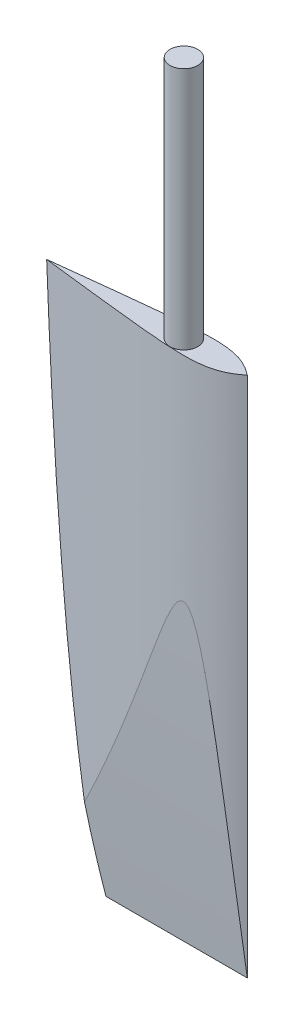
ISO-10303-21;
HEADER;
FILE_DESCRIPTION(('STEP AP214'),'2;1');
FILE_NAME('part.step','',(''),(''),'','','');
FILE_SCHEMA(('AUTOMOTIVE_DESIGN { 1 0 10303 214 1 1 1 1 }'));
ENDSEC;
DATA;
#1=APPLICATION_CONTEXT('core data for automotive mechanical design processes');
#2=APPLICATION_PROTOCOL_DEFINITION('international standard','automotive_design',2000,#1);
#3=PRODUCT_CONTEXT('',#1,'mechanical');
#4=PRODUCT('Part','Part','',(#3));
#5=PRODUCT_RELATED_PRODUCT_CATEGORY('part','',(#4));
#6=PRODUCT_DEFINITION_FORMATION('','',#4);
#7=PRODUCT_DEFINITION_CONTEXT('part definition',#1,'design');
#8=PRODUCT_DEFINITION('design','',#6,#7);
#9=PRODUCT_DEFINITION_SHAPE('','',#8);
#10=(LENGTH_UNIT() NAMED_UNIT(*) SI_UNIT(.MILLI.,.METRE.));
#11=(NAMED_UNIT(*) PLANE_ANGLE_UNIT() SI_UNIT($,.RADIAN.));
#12=(NAMED_UNIT(*) SI_UNIT($,.STERADIAN.) SOLID_ANGLE_UNIT());
#13=UNCERTAINTY_MEASURE_WITH_UNIT(LENGTH_MEASURE(1.E-05),#10,'distance_accuracy_value','');
#14=(GEOMETRIC_REPRESENTATION_CONTEXT(3) GLOBAL_UNCERTAINTY_ASSIGNED_CONTEXT((#13)) GLOBAL_UNIT_ASSIGNED_CONTEXT((#10,
#11,#12)) REPRESENTATION_CONTEXT('',''));
#15=CARTESIAN_POINT('',(0.,0.,0.));
#16=DIRECTION('',(0.,0.,1.));
#17=DIRECTION('',(1.,0.,0.));
#18=AXIS2_PLACEMENT_3D('',#15,#16,#17);
#19=CARTESIAN_POINT('',(9.11438835745229,-75.,0.));
#20=CARTESIAN_POINT('',(5.1335415190364,-75.,3.10462526864879));
#21=CARTESIAN_POINT('',(2.0653861128247,-75.,2.48117780207058));
#22=CARTESIAN_POINT('',(-19.7170451046892,-75.,0.));
#23=B_SPLINE_CURVE_WITH_KNOTS('',3,(#19,#20,#21,#22),.UNSPECIFIED.,.F.,.F.,(4,4),(0.,1.),.UNSPECIFIED.);
#24=DIRECTION('',(0.,1.,0.));
#25=VECTOR('',#24,1.);
#26=SURFACE_OF_LINEAR_EXTRUSION('',#23,#25);
#27=CARTESIAN_POINT('',(9.11438835745229,-75.,0.));
#28=CARTESIAN_POINT('',(9.02791330218049,-74.0256277634483,0.0674326613923812));
#29=CARTESIAN_POINT('',(8.94120435272638,-73.0511908608038,0.13364105846246));
#30=CARTESIAN_POINT('',(8.76669162256768,-71.1010093409619,0.26362649330421));
#31=CARTESIAN_POINT('',(8.67888659948901,-70.1252646237755,0.327400360832244));
#32=CARTESIAN_POINT('',(8.50168240376331,-68.1727797983576,0.45242542912736));
#33=CARTESIAN_POINT('',(8.41228173870845,-67.1960396611863,0.513674069469376));
#34=CARTESIAN_POINT('',(8.23129873934822,-65.2418849312636,0.633556690601031));
#35=CARTESIAN_POINT('',(8.13971487292022,-64.2644703619941,0.692188746988952));
#36=CARTESIAN_POINT('',(7.95369224847968,-62.3092954016953,0.806746393799288));
#37=CARTESIAN_POINT('',(7.85925218866321,-61.3315350600015,0.862670718935928));
#38=CARTESIAN_POINT('',(7.66672681363479,-59.3760082423912,0.971721091397303));
#39=CARTESIAN_POINT('',(7.56864073692468,-58.3982418083236,1.02484654849274));
#40=CARTESIAN_POINT('',(7.36171535963916,-56.3829901725165,1.13138290548702));
#41=CARTESIAN_POINT('',(7.25258560456741,-55.3455249794059,1.18461098864575));
#42=CARTESIAN_POINT('',(7.02775556366977,-53.2713421104585,1.28770617560209));
#43=CARTESIAN_POINT('',(6.91205656153735,-52.2346243283941,1.33757393190312));
#44=CARTESIAN_POINT('',(6.672287633419,-50.1623699469067,1.43384054300639));
#45=CARTESIAN_POINT('',(6.5482207705174,-49.1268330548569,1.48024065418127));
#46=CARTESIAN_POINT('',(6.35393698226747,-47.5746911524056,1.54716195278202));
#47=CARTESIAN_POINT('',(6.28782868300554,-47.0576286156837,1.56901764070525));
#48=CARTESIAN_POINT('',(6.152445226113,-46.0238816363463,1.61182621695569));
#49=CARTESIAN_POINT('',(6.08317008092178,-45.5071971922536,1.63277910882846));
#50=CARTESIAN_POINT('',(5.94096995765408,-44.4745566796208,1.67375708302899));
#51=CARTESIAN_POINT('',(5.86804682405096,-43.9586003759368,1.69378262456902));
#52=CARTESIAN_POINT('',(5.71785045448301,-42.9272879565016,1.73290128775518));
#53=CARTESIAN_POINT('',(5.64057725606253,-42.4119318356095,1.75199441744608));
#54=CARTESIAN_POINT('',(5.4808082720536,-41.3821237766656,1.7892269816325));
#55=CARTESIAN_POINT('',(5.39831378614404,-40.8676716461067,1.8073666514207));
#56=CARTESIAN_POINT('',(5.2268611918578,-39.8398168439078,1.84267847723422));
#57=CARTESIAN_POINT('',(5.13790326475997,-39.3264141432495,1.85985066037047));
#58=CARTESIAN_POINT('',(4.99865891695445,-38.5597721197334,1.88479044997102));
#59=CARTESIAN_POINT('',(4.95150883418106,-38.3059745668074,1.89293129621597));
#60=CARTESIAN_POINT('',(4.85483851194004,-37.7987801155866,1.9089683375384));
#61=CARTESIAN_POINT('',(4.80531789628173,-37.5453832875201,1.91686449345512));
#62=CARTESIAN_POINT('',(4.70349976880782,-37.0390457049813,1.93240985075691));
#63=CARTESIAN_POINT('',(4.65120128282113,-36.786105143101,1.94005896397413));
#64=CARTESIAN_POINT('',(4.5432831781724,-36.2807620521463,1.95510739128665));
#65=CARTESIAN_POINT('',(4.48766155431423,-36.0283599450702,1.96250655025646));
#66=CARTESIAN_POINT('',(4.37277022521815,-35.5260393166599,1.9769987988232));
#67=CARTESIAN_POINT('',(4.31352557686247,-35.2761151453946,1.98409351643389));
#68=CARTESIAN_POINT('',(4.19008295522094,-34.7775155712979,1.99801674955925));
#69=CARTESIAN_POINT('',(4.12588564615142,-34.5288400057602,2.00484530058606));
#70=CARTESIAN_POINT('',(3.99111216058201,-34.0333987766084,2.01822038168161));
#71=CARTESIAN_POINT('',(3.92054105679476,-33.7866317609291,2.02476713000653));
#72=CARTESIAN_POINT('',(3.80808279704943,-33.4185812309951,2.03436167834496));
#73=CARTESIAN_POINT('',(3.7695104676599,-33.2962883324942,2.03752124481927));
#74=CARTESIAN_POINT('',(3.68969355580781,-33.0525787032477,2.04376161586078));
#75=CARTESIAN_POINT('',(3.64844912448883,-32.9311619233766,2.04684242486905));
#76=CARTESIAN_POINT('',(3.56259643930917,-32.6892481578053,2.05292527863883));
#77=CARTESIAN_POINT('',(3.51798183764883,-32.5687534035837,2.05592715964783));
#78=CARTESIAN_POINT('',(3.42455490409411,-32.3293087764526,2.06183798635663));
#79=CARTESIAN_POINT('',(3.37574010794178,-32.2103598582404,2.06474687610686));
#80=CARTESIAN_POINT('',(3.27236344825315,-31.9741642178653,2.07047004040162));
#81=CARTESIAN_POINT('',(3.21777190927501,-31.8569301931658,2.07328371763761));
#82=CARTESIAN_POINT('',(3.13018539373064,-31.6840252864044,2.07739565276573));
#83=CARTESIAN_POINT('',(3.10005492784772,-31.6269064964481,2.07874761433164));
#84=CARTESIAN_POINT('',(3.03749034337446,-31.5139494986544,2.08140904644917));
#85=CARTESIAN_POINT('',(3.005056710571,-31.4581110240389,2.08271852587679));
#86=CARTESIAN_POINT('',(2.93679056837549,-31.3471969966507,2.08530795911265));
#87=CARTESIAN_POINT('',(2.90090892794699,-31.2921513987774,2.08658700897921));
#88=CARTESIAN_POINT('',(2.82553725415653,-31.1846093660097,2.08907488131302));
#89=CARTESIAN_POINT('',(2.78604987648969,-31.1321110979098,2.09028375441035));
#90=CARTESIAN_POINT('',(2.70289443652817,-31.0313291839522,2.0925948321861));
#91=CARTESIAN_POINT('',(2.65927043082211,-30.9830097325643,2.09369795424529));
#92=CARTESIAN_POINT('',(2.56644242607435,-30.8921543941663,2.09576447751712));
#93=CARTESIAN_POINT('',(2.51725713407338,-30.8496001171732,2.09672832368569));
#94=CARTESIAN_POINT('',(2.42794459123065,-30.7850558655047,2.09818590346269));
#95=CARTESIAN_POINT('',(2.38953296272161,-30.7607280325339,2.09873389098076));
#96=CARTESIAN_POINT('',(2.30937364785024,-30.7183343938264,2.0996872814254));
#97=CARTESIAN_POINT('',(2.26763187980661,-30.7002577706546,2.10009293067992));
#98=CARTESIAN_POINT('',(2.18846409834264,-30.6745130774032,2.10067012804831));
#99=CARTESIAN_POINT('',(2.1514383957057,-30.6656312586181,2.10086899903435));
#100=CARTESIAN_POINT('',(2.07640383294961,-30.6543523804152,2.10112148828131));
#101=CARTESIAN_POINT('',(2.03839531239053,-30.6519531107402,2.10117515605));
#102=CARTESIAN_POINT('',(1.96261614493755,-30.6536876471845,2.10113634159628));
#103=CARTESIAN_POINT('',(1.92484519053694,-30.6578095397875,2.10104412588853));
#104=CARTESIAN_POINT('',(1.85041514998592,-30.6718693138571,2.10072929566716));
#105=CARTESIAN_POINT('',(1.81375708778143,-30.6818123902814,2.10050656467856));
#106=CARTESIAN_POINT('',(1.72248542696054,-30.7132195181988,2.09980209261424));
#107=CARTESIAN_POINT('',(1.66903208796334,-30.7380108735487,2.09924530686686));
#108=CARTESIAN_POINT('',(1.56646747131248,-30.7953349394594,2.09795413263476));
#109=CARTESIAN_POINT('',(1.51737046078588,-30.8278918853224,2.09721918802215));
#110=CARTESIAN_POINT('',(1.41029900362024,-30.9076375071088,2.09541302289413));
#111=CARTESIAN_POINT('',(1.35351849232511,-30.9564013864725,2.0943046256963));
#112=CARTESIAN_POINT('',(1.24481842732609,-31.0591324497693,2.091958658142));
#113=CARTESIAN_POINT('',(1.19290882098485,-31.1131098436077,2.09072083391385));
#114=CARTESIAN_POINT('',(1.09264496462421,-31.2248007892816,2.08814700203177));
#115=CARTESIAN_POINT('',(1.04431312083691,-31.2825342241445,2.08681046576974));
#116=CARTESIAN_POINT('',(0.950760291391325,-31.4003466038377,2.08406934333141));
#117=CARTESIAN_POINT('',(0.905536240614965,-31.4604231433084,2.08266482660237));
#118=CARTESIAN_POINT('',(0.798673788574268,-31.6084314539139,2.07918684796826));
#119=CARTESIAN_POINT('',(0.738301434701409,-31.6972727318676,2.07708453158192));
#120=CARTESIAN_POINT('',(0.62126594226346,-31.8773764701522,2.07279088578356));
#121=CARTESIAN_POINT('',(0.564604056727649,-31.9686397339183,2.07059952670244));
#122=CARTESIAN_POINT('',(0.45405329162308,-32.1530870983062,2.06613772878302));
#123=CARTESIAN_POINT('',(0.400170619872975,-32.2462748987206,2.06386713042383));
#124=CARTESIAN_POINT('',(0.294712074852388,-32.4339487638451,2.059260360012));
#125=CARTESIAN_POINT('',(0.243136400360533,-32.5284349395142,2.05692418233695));
#126=CARTESIAN_POINT('',(0.0910817219798974,-32.8135757491686,2.04982203145845));
#127=CARTESIAN_POINT('',(-0.00660843573019216,-33.0057133347924,2.0449672573794));
#128=CARTESIAN_POINT('',(-0.19702474733746,-33.3927069144916,2.03504597796757));
#129=CARTESIAN_POINT('',(-0.289744262150923,-33.5875661266191,2.02997920479584));
#130=CARTESIAN_POINT('',(-0.471368406459699,-33.9786755170014,2.01966452772378));
#131=CARTESIAN_POINT('',(-0.560278746974669,-34.1749230593902,2.01441691790478));
#132=CARTESIAN_POINT('',(-0.735342535305995,-34.5684966883978,2.00374725761352));
#133=CARTESIAN_POINT('',(-0.82149756040096,-34.7658220794098,1.99832531063939));
#134=CARTESIAN_POINT('',(-1.03289505285181,-35.2568185010536,1.98465287067218));
#135=CARTESIAN_POINT('',(-1.15692563130682,-35.5510074966346,1.97630063959406));
#136=CARTESIAN_POINT('',(-1.40204703065354,-36.1405995791394,1.95924025621835));
#137=CARTESIAN_POINT('',(-1.52313777631965,-36.436002696905,1.95053209482834));
#138=CARTESIAN_POINT('',(-1.76344208783834,-37.027781633835,1.93276658489777));
#139=CARTESIAN_POINT('',(-1.88265439231028,-37.3241579575617,1.92370901471728));
#140=CARTESIAN_POINT('',(-2.11982037616826,-37.9174038818739,1.90525968695534));
#141=CARTESIAN_POINT('',(-2.23777404974849,-38.2142734847275,1.89586792783322));
#142=CARTESIAN_POINT('',(-2.59064803769979,-39.105548819218,1.86719581970142));
#143=CARTESIAN_POINT('',(-2.82448004996238,-39.70036887925,1.84742621372072));
#144=CARTESIAN_POINT('',(-3.29203174863963,-40.8900555468465,1.80663661475038));
#145=CARTESIAN_POINT('',(-3.52575142639771,-41.4849221548407,1.78561653736996));
#146=CARTESIAN_POINT('',(-3.99382470684585,-42.6716890253508,1.74245867502772));
#147=CARTESIAN_POINT('',(-4.22817230060031,-43.263591821099,1.72032555931621));
#148=CARTESIAN_POINT('',(-4.69947770229386,-44.4461700351071,1.67491480357016));
#149=CARTESIAN_POINT('',(-4.93643494950464,-45.0368456858253,1.6516374058196));
#150=CARTESIAN_POINT('',(-5.41376622184377,-46.2166937833874,1.60397738188887));
#151=CARTESIAN_POINT('',(-5.65413985679052,-46.8058663929694,1.57959488123592));
#152=CARTESIAN_POINT('',(-6.13890223886095,-47.9825160535133,1.52976153663236));
#153=CARTESIAN_POINT('',(-6.3832910036852,-48.5699930969871,1.50431068797121));
#154=CARTESIAN_POINT('',(-6.94054827767958,-49.895331464872,1.44563678488763));
#155=CARTESIAN_POINT('',(-7.25472077413208,-50.6326320213299,1.41211157660739));
#156=CARTESIAN_POINT('',(-7.89078175189394,-52.1039125063527,1.34349848352858));
#157=CARTESIAN_POINT('',(-8.21267099075233,-52.8378921004229,1.30841044501521));
#158=CARTESIAN_POINT('',(-8.86460414755739,-54.3021884523702,1.23674626936083));
#159=CARTESIAN_POINT('',(-9.19464842309893,-55.0325050479311,1.20017006691883));
#160=CARTESIAN_POINT('',(-9.86321537788058,-56.4891854947522,1.12560224417847));
#161=CARTESIAN_POINT('',(-10.2017381486153,-57.2155493032534,1.08761060860351));
#162=CARTESIAN_POINT('',(-10.8874999745474,-58.6640740936384,1.01028277653863));
#163=CARTESIAN_POINT('',(-11.2347389725863,-59.3862351030447,0.9709465888653));
#164=CARTESIAN_POINT('',(-11.9381061443612,-60.8261339980449,0.890998793757987));
#165=CARTESIAN_POINT('',(-12.2942342085373,-61.5438719380184,0.850387202042089));
#166=CARTESIAN_POINT('',(-13.0192701505864,-62.9822044057927,0.767525354651593));
#167=CARTESIAN_POINT('',(-13.388272635595,-63.7027505239864,0.725262417497971));
#168=CARTESIAN_POINT('',(-14.13556346473,-65.1389472086499,0.639570854682089));
#169=CARTESIAN_POINT('',(-14.5138518605502,-65.854597747838,0.596142222530379));
#170=CARTESIAN_POINT('',(-15.2797714984637,-67.2808533415495,0.508184444396395));
#171=CARTESIAN_POINT('',(-15.6674031365872,-67.9914581805432,0.463655251762845));
#172=CARTESIAN_POINT('',(-16.4520379612058,-69.4074879709152,0.373559623929728));
#173=CARTESIAN_POINT('',(-16.8490419387708,-70.1129124784131,0.32799310118626));
#174=CARTESIAN_POINT('',(-17.6524278483057,-71.5184595623103,0.235884361659047));
#175=CARTESIAN_POINT('',(-18.0588109969249,-72.2185814350381,0.189342018366134));
#176=CARTESIAN_POINT('',(-18.8809357397486,-73.6134153806393,0.0953409520840676));
#177=CARTESIAN_POINT('',(-19.2966789883173,-74.3081264675032,0.0478820673136597));
#178=CARTESIAN_POINT('',(-19.7170451046892,-75.,0.));
#179=B_SPLINE_CURVE_WITH_KNOTS('',3,(#27,#28,#29,#30,#31,#32,#33,#34,#35,#36,#37,#38,#39,#40,
#41,#42,#43,#44,#45,#46,#47,#48,#49,#50,#51,#52,#53,#54,#55,#56,#57,#58,#59,#60,#61,#62,#63,#64,
#65,#66,#67,#68,#69,#70,#71,#72,#73,#74,#75,#76,#77,#78,#79,#80,#81,#82,#83,#84,#85,#86,#87,#88,
#89,#90,#91,#92,#93,#94,#95,#96,#97,#98,#99,#100,#101,#102,#103,#104,#105,#106,#107,#108,#109,
#110,#111,#112,#113,#114,#115,#116,#117,#118,#119,#120,#121,#122,#123,#124,#125,#126,#127,#128,
#129,#130,#131,#132,#133,#134,#135,#136,#137,#138,#139,#140,#141,#142,#143,#144,#145,#146,#147,
#148,#149,#150,#151,#152,#153,#154,#155,#156,#157,#158,#159,#160,#161,#162,#163,#164,#165,#166,
#167,#168,#169,#170,#171,#172,#173,#174,#175,#176,#177,#178),.UNSPECIFIED.,.F.,.F.,(4,2,2,2,2,2,
2,2,2,2,2,2,2,2,2,2,2,2,2,2,2,2,2,2,2,2,2,2,2,2,2,2,2,2,2,2,2,2,2,2,2,2,2,2,2,2,2,2,2,2,2,2,2,2,
2,2,2,2,2,2,2,2,2,2,2,2,2,2,2,2,2,2,2,2,2,4),(0.,2.94157080724285,5.88684982603402,
8.83504520497663,11.7853742955752,14.7370689858018,17.6893836623501,20.8229998370127,
23.956005766664,27.0878710085475,28.653051093684,30.2182250313126,31.7826154400741,
33.3469923490285,34.9109813743832,36.4749265517689,37.2497230648159,38.0246429441313,
38.7998363977063,39.5755024254857,40.3463056047731,41.1170055884199,41.8870975109422,
42.2718857775375,42.6566522981115,43.042162529149,43.427900502092,43.8157262431351,
44.0094640246038,44.2031610633375,44.4002122548974,44.5971194673747,44.7921250984182,
44.9864932606867,45.12249059487,45.2582514001874,45.3719602156787,45.485630256692,
45.5990928735036,45.7126569016331,45.88840968498,46.0647183146497,46.288746743349,
46.5132231551734,46.7390036316881,46.9645581335835,47.2867214029648,47.6089929120855,
47.931955588676,48.2549460394212,48.9016191730098,49.5491355570683,50.1956444892443,
50.8417764507147,51.7998745192141,52.7579970781181,53.7167377310909,54.6754828046325,
56.5937885649874,58.5122239335831,60.4231916627465,62.333756502392,64.244104864651,
66.154461650878,68.5608604482296,70.9674964559155,73.3742381814988,75.7810058903251,
78.1877578203808,80.5944801012473,83.0263292654894,85.4581919706992,87.8901579366852,
90.3223299112345,92.7548191759808,95.1877418031412),.UNSPECIFIED.);
#180=CARTESIAN_POINT('',(9.11438835745229,-75.,0.));
#181=VERTEX_POINT('',#180);
#182=CARTESIAN_POINT('',(-13.5862064145392,-64.0823131529924,0.702561526516239));
#183=VERTEX_POINT('',#182);
#184=EDGE_CURVE('E87',#181,#183,#179,.T.);
#185=ORIENTED_EDGE('',*,*,#184,.F.);
#186=DIRECTION('',(0.,1.,0.));
#187=VECTOR('',#186,1.);
#188=CARTESIAN_POINT('',(9.11438835745229,-75.,0.));
#189=LINE('',#188,#187);
#190=CARTESIAN_POINT('',(9.11438835745229,0.,0.));
#191=VERTEX_POINT('',#190);
#192=EDGE_CURVE('E96',#181,#191,#189,.T.);
#193=ORIENTED_EDGE('',*,*,#192,.T.);
#194=CARTESIAN_POINT('',(9.11438835745229,0.,0.));
#195=CARTESIAN_POINT('',(5.1335415190364,0.,3.10462526864879));
#196=CARTESIAN_POINT('',(2.0653861128247,0.,2.48117780207058));
#197=CARTESIAN_POINT('',(-19.7170451046892,0.,0.));
#198=B_SPLINE_CURVE_WITH_KNOTS('',3,(#194,#195,#196,#197),.UNSPECIFIED.,.F.,.F.,(4,4),(0.,1.),.UNSPECIFIED.);
#199=CARTESIAN_POINT('',(2.01572188577903,0.,2.10115964797299));
#200=VERTEX_POINT('',#199);
#201=EDGE_CURVE('E103',#191,#200,#198,.T.);
#202=ORIENTED_EDGE('',*,*,#201,.T.);
#203=CARTESIAN_POINT('',(-19.7170451046891,0.,0.));
#204=VERTEX_POINT('',#203);
#205=EDGE_CURVE('E60',#200,#204,#198,.T.);
#206=ORIENTED_EDGE('',*,*,#205,.T.);
#207=CARTESIAN_POINT('',(-11.1899391938755,-75.,0.975979598458478));
#208=CARTESIAN_POINT('',(-11.3483951700577,-74.3943088535673,0.958016288512149));
#209=CARTESIAN_POINT('',(-11.5019723879378,-73.7873420663908,0.940576766996451));
#210=CARTESIAN_POINT('',(-11.8002341559405,-72.5712274735197,0.906661860987847));
#211=CARTESIAN_POINT('',(-11.9449191085149,-71.9620797678527,0.890186432863024));
#212=CARTESIAN_POINT('',(-12.2261579719592,-70.7424278829241,0.858128046382457));
#213=CARTESIAN_POINT('',(-12.3627185686905,-70.1319252602244,0.842544354595426));
#214=CARTESIAN_POINT('',(-12.628545255993,-68.9093099206418,0.812184050515306));
#215=CARTESIAN_POINT('',(-12.757811252167,-68.2971971830301,0.797407448666607));
#216=CARTESIAN_POINT('',(-13.1355390705937,-66.459179993238,0.754200983149289));
#217=CARTESIAN_POINT('',(-13.3740231093354,-65.2311918372964,0.726883917094089));
#218=CARTESIAN_POINT('',(-13.8284117519242,-62.7710793492255,0.674797818235384));
#219=CARTESIAN_POINT('',(-14.0443172538367,-61.5389551836203,0.650028684088076));
#220=CARTESIAN_POINT('',(-14.4563384955626,-59.0734167311357,0.602741957883882));
#221=CARTESIAN_POINT('',(-14.6524856301596,-57.8400077407549,0.580220794480271));
#222=CARTESIAN_POINT('',(-15.0278814878238,-55.3704020418875,0.537111942594132));
#223=CARTESIAN_POINT('',(-15.2071275726004,-54.1342049289064,0.51652455598027));
#224=CARTESIAN_POINT('',(-15.5506983065003,-51.6595864803544,0.477063974493507));
#225=CARTESIAN_POINT('',(-15.7150213862538,-50.4211649247846,0.458190959911555));
#226=CARTESIAN_POINT('',(-16.0303631790629,-47.9426139524644,0.42197757840529));
#227=CARTESIAN_POINT('',(-16.1813819085485,-46.702484537825,0.404637209588246));
#228=CARTESIAN_POINT('',(-16.4733527947432,-44.2047920832427,0.371119334962212));
#229=CARTESIAN_POINT('',(-16.6141497745006,-42.9472107148258,0.354959737277964));
#230=CARTESIAN_POINT('',(-16.8846760273209,-40.4309525332045,0.323919138339396));
#231=CARTESIAN_POINT('',(-17.0144062282323,-39.1722758207909,0.309038029894663));
#232=CARTESIAN_POINT('',(-17.2638233350999,-36.6539440541955,0.280436607181031));
#233=CARTESIAN_POINT('',(-17.3835104541572,-35.3942890213452,0.266716268282064));
#234=CARTESIAN_POINT('',(-17.6137694957619,-32.8735292340625,0.240329188988717));
#235=CARTESIAN_POINT('',(-17.724337029018,-31.6124240743449,0.22766295591339));
#236=CARTESIAN_POINT('',(-17.9370491316759,-29.0894688306017,0.203303708900711));
#237=CARTESIAN_POINT('',(-18.0391935221219,-27.8276187313227,0.19161071564048));
#238=CARTESIAN_POINT('',(-18.2357146050679,-25.303299662616,0.169121707721383));
#239=CARTESIAN_POINT('',(-18.330091251996,-24.0408306896012,0.158325698324948));
#240=CARTESIAN_POINT('',(-18.5117972879509,-21.5133668956038,0.137546976068681));
#241=CARTESIAN_POINT('',(-18.5991152604104,-20.248371244683,0.127565580509692));
#242=CARTESIAN_POINT('',(-18.7670486835395,-17.7179389890285,0.108375442347779));
#243=CARTESIAN_POINT('',(-18.8476641808883,-16.4525023874273,0.0991666943637742));
#244=CARTESIAN_POINT('',(-19.0026484078661,-13.9212425002239,0.0814685723942654));
#245=CARTESIAN_POINT('',(-19.0770171379497,-12.6554192146499,0.0729791983564049));
#246=CARTESIAN_POINT('',(-19.2198612036852,-10.1243676723726,0.0566783392408809));
#247=CARTESIAN_POINT('',(-19.2883408213842,-8.85913966009407,0.0488663615849288));
#248=CARTESIAN_POINT('',(-19.4198330315598,-6.32839739284938,0.0338705784832336));
#249=CARTESIAN_POINT('',(-19.4828456277456,-5.06288313807804,0.0266867726112971));
#250=CARTESIAN_POINT('',(-19.603724587446,-2.53161446058037,0.0129098096703536));
#251=CARTESIAN_POINT('',(-19.6615909875625,-1.26586003962639,0.00631664840042329));
#252=CARTESIAN_POINT('',(-19.7170451046892,0.,0.));
#253=B_SPLINE_CURVE_WITH_KNOTS('',3,(#207,#208,#209,#210,#211,#212,#213,#214,#215,#216,#217,
#218,#219,#220,#221,#222,#223,#224,#225,#226,#227,#228,#229,#230,#231,#232,#233,#234,#235,#236,
#237,#238,#239,#240,#241,#242,#243,#244,#245,#246,#247,#248,#249,#250,#251,#252),.UNSPECIFIED.,
.F.,.F.,(4,2,2,2,2,2,2,2,2,2,2,2,2,2,2,2,2,2,2,2,2,2,4),(0.,1.87895480372987,3.757824505847,
5.63512599015072,7.51245176248361,11.2658577831801,15.0191144546591,18.7663101183243,
22.5140897623081,26.2622630841898,30.0104317772285,33.8070020736703,37.6032537488275,
41.3994248520919,45.1974125325842,48.9954808832469,52.7935715148765,56.5976870667829,
60.4017761228354,64.2058649020223,68.0071638725336,71.8084602639721,75.6097296167767),.UNSPECIFIED.);
#254=EDGE_CURVE('E98',#183,#204,#253,.T.);
#255=ORIENTED_EDGE('',*,*,#254,.F.);
#256=EDGE_LOOP('',(#185,#193,#202,#206,#255));
#257=FACE_BOUND('',#256,.T.);
#258=ADVANCED_FACE('F33',(#257),#26,.F.);
#259=CARTESIAN_POINT('',(9.11438835745229,-75.,0.));
#260=CARTESIAN_POINT('',(5.1335415190364,-75.,-3.10462526864879));
#261=CARTESIAN_POINT('',(2.0653861128247,-75.,-2.48117780207058));
#262=CARTESIAN_POINT('',(-19.7170451046892,-75.,0.));
#263=B_SPLINE_CURVE_WITH_KNOTS('',3,(#259,#260,#261,#262),.UNSPECIFIED.,.F.,.F.,(4,4),(0.,1.),.UNSPECIFIED.);
#264=DIRECTION('',(0.,1.,0.));
#265=VECTOR('',#264,1.);
#266=SURFACE_OF_LINEAR_EXTRUSION('',#263,#265);
#267=ORIENTED_EDGE('',*,*,#192,.F.);
#268=CARTESIAN_POINT('',(9.11438835745229,-75.,0.));
#269=CARTESIAN_POINT('',(9.02791330218048,-74.0256277634482,-0.0674326613923807));
#270=CARTESIAN_POINT('',(8.94120435272637,-73.0511908608038,-0.13364105846246));
#271=CARTESIAN_POINT('',(8.76669162256767,-71.1010093409618,-0.263626493304213));
#272=CARTESIAN_POINT('',(8.678886599489,-70.1252646237754,-0.327400360832248));
#273=CARTESIAN_POINT('',(8.5016824037633,-68.1727797983575,-0.452425429127366));
#274=CARTESIAN_POINT('',(8.41228173870844,-67.1960396611861,-0.513674069469383));
#275=CARTESIAN_POINT('',(8.23129873934821,-65.2418849312635,-0.633556690601039));
#276=CARTESIAN_POINT('',(8.13971487292021,-64.264470361994,-0.69218874698896));
#277=CARTESIAN_POINT('',(7.95369224847966,-62.3092954016951,-0.806746393799298));
#278=CARTESIAN_POINT('',(7.85925218866319,-61.3315350600013,-0.862670718935938));
#279=CARTESIAN_POINT('',(7.66672681363477,-59.3760082423911,-0.971721091397313));
#280=CARTESIAN_POINT('',(7.56864073692465,-58.3982418083234,-1.02484654849275));
#281=CARTESIAN_POINT('',(7.36171535963914,-56.3829901725163,-1.13138290548704));
#282=CARTESIAN_POINT('',(7.25258560456739,-55.3455249794057,-1.18461098864576));
#283=CARTESIAN_POINT('',(7.02775556366976,-53.2713421104583,-1.2877061756021));
#284=CARTESIAN_POINT('',(6.91205656153734,-52.2346243283939,-1.33757393190313));
#285=CARTESIAN_POINT('',(6.67228763341898,-50.1623699469065,-1.4338405430064));
#286=CARTESIAN_POINT('',(6.54822077051738,-49.1268330548568,-1.48024065418128));
#287=CARTESIAN_POINT('',(6.35393698226746,-47.5746911524055,-1.54716195278203));
#288=CARTESIAN_POINT('',(6.28782868300553,-47.0576286156836,-1.56901764070525));
#289=CARTESIAN_POINT('',(6.152445226113,-46.0238816363462,-1.61182621695569));
#290=CARTESIAN_POINT('',(6.08317008092177,-45.5071971922535,-1.63277910882847));
#291=CARTESIAN_POINT('',(5.94096995765407,-44.4745566796207,-1.67375708302899));
#292=CARTESIAN_POINT('',(5.86804682405095,-43.9586003759367,-1.69378262456902));
#293=CARTESIAN_POINT('',(5.717850454483,-42.9272879565016,-1.73290128775518));
#294=CARTESIAN_POINT('',(5.64057725606253,-42.4119318356095,-1.75199441744608));
#295=CARTESIAN_POINT('',(5.4808082720536,-41.3821237766656,-1.7892269816325));
#296=CARTESIAN_POINT('',(5.39831378614404,-40.8676716461067,-1.8073666514207));
#297=CARTESIAN_POINT('',(5.22686119185779,-39.8398168439078,-1.84267847723422));
#298=CARTESIAN_POINT('',(5.13790326475996,-39.3264141432495,-1.85985066037047));
#299=CARTESIAN_POINT('',(4.99865891695445,-38.5597721197334,-1.88479044997102));
#300=CARTESIAN_POINT('',(4.95150883418106,-38.3059745668074,-1.89293129621597));
#301=CARTESIAN_POINT('',(4.85483851194004,-37.7987801155866,-1.9089683375384));
#302=CARTESIAN_POINT('',(4.80531789628174,-37.5453832875201,-1.91686449345512));
#303=CARTESIAN_POINT('',(4.70349976880783,-37.0390457049813,-1.93240985075691));
#304=CARTESIAN_POINT('',(4.65120128282114,-36.786105143101,-1.94005896397412));
#305=CARTESIAN_POINT('',(4.5432831781724,-36.2807620521463,-1.95510739128665));
#306=CARTESIAN_POINT('',(4.48766155431424,-36.0283599450702,-1.96250655025646));
#307=CARTESIAN_POINT('',(4.37277022521815,-35.5260393166599,-1.9769987988232));
#308=CARTESIAN_POINT('',(4.31352557686247,-35.2761151453946,-1.98409351643389));
#309=CARTESIAN_POINT('',(4.19008295522093,-34.7775155712979,-1.99801674955925));
#310=CARTESIAN_POINT('',(4.12588564615142,-34.5288400057602,-2.00484530058606));
#311=CARTESIAN_POINT('',(3.99111216058201,-34.0333987766084,-2.01822038168161));
#312=CARTESIAN_POINT('',(3.92054105679475,-33.7866317609291,-2.02476713000653));
#313=CARTESIAN_POINT('',(3.80808279704942,-33.4185812309951,-2.03436167834496));
#314=CARTESIAN_POINT('',(3.7695104676599,-33.2962883324942,-2.03752124481927));
#315=CARTESIAN_POINT('',(3.68969355580781,-33.0525787032477,-2.04376161586078));
#316=CARTESIAN_POINT('',(3.64844912448882,-32.9311619233766,-2.04684242486905));
#317=CARTESIAN_POINT('',(3.56259643930916,-32.6892481578053,-2.05292527863883));
#318=CARTESIAN_POINT('',(3.51798183764882,-32.5687534035836,-2.05592715964783));
#319=CARTESIAN_POINT('',(3.4245549040941,-32.3293087764526,-2.06183798635663));
#320=CARTESIAN_POINT('',(3.37574010794177,-32.2103598582404,-2.06474687610686));
#321=CARTESIAN_POINT('',(3.27236344825316,-31.9741642178653,-2.07047004040162));
#322=CARTESIAN_POINT('',(3.21777190927503,-31.8569301931658,-2.07328371763761));
#323=CARTESIAN_POINT('',(3.13018539373066,-31.6840252864044,-2.07739565276573));
#324=CARTESIAN_POINT('',(3.10005492784774,-31.6269064964481,-2.07874761433164));
#325=CARTESIAN_POINT('',(3.03749034337447,-31.5139494986545,-2.08140904644917));
#326=CARTESIAN_POINT('',(3.00505671057102,-31.458111024039,-2.08271852587679));
#327=CARTESIAN_POINT('',(2.93679056837551,-31.3471969966508,-2.08530795911264));
#328=CARTESIAN_POINT('',(2.90090892794701,-31.2921513987775,-2.08658700897921));
#329=CARTESIAN_POINT('',(2.82553725415655,-31.1846093660097,-2.08907488131301));
#330=CARTESIAN_POINT('',(2.78604987648971,-31.1321110979099,-2.09028375441035));
#331=CARTESIAN_POINT('',(2.7028944365282,-31.0313291839522,-2.0925948321861));
#332=CARTESIAN_POINT('',(2.65927043082215,-30.9830097325644,-2.09369795424529));
#333=CARTESIAN_POINT('',(2.5664424260744,-30.8921543941664,-2.09576447751711));
#334=CARTESIAN_POINT('',(2.51725713407345,-30.8496001171733,-2.09672832368569));
#335=CARTESIAN_POINT('',(2.42794459123072,-30.7850558655048,-2.09818590346269));
#336=CARTESIAN_POINT('',(2.38953296272167,-30.7607280325339,-2.09873389098075));
#337=CARTESIAN_POINT('',(2.30937364785031,-30.7183343938264,-2.0996872814254));
#338=CARTESIAN_POINT('',(2.26763187980669,-30.7002577706546,-2.10009293067992));
#339=CARTESIAN_POINT('',(2.18846409834273,-30.6745130774032,-2.1006701280483));
#340=CARTESIAN_POINT('',(2.15143839570578,-30.6656312586182,-2.10086899903435));
#341=CARTESIAN_POINT('',(2.0764038329497,-30.6543523804152,-2.10112148828131));
#342=CARTESIAN_POINT('',(2.03839531239062,-30.6519531107402,-2.10117515605));
#343=CARTESIAN_POINT('',(1.96261614493764,-30.6536876471845,-2.10113634159628));
#344=CARTESIAN_POINT('',(1.92484519053705,-30.6578095397876,-2.10104412588853));
#345=CARTESIAN_POINT('',(1.85041514998602,-30.6718693138571,-2.10072929566716));
#346=CARTESIAN_POINT('',(1.81375708778152,-30.6818123902813,-2.10050656467856));
#347=CARTESIAN_POINT('',(1.72248542696063,-30.7132195181987,-2.09980209261424));
#348=CARTESIAN_POINT('',(1.66903208796345,-30.7380108735486,-2.09924530686686));
#349=CARTESIAN_POINT('',(1.56646747131261,-30.7953349394594,-2.09795413263476));
#350=CARTESIAN_POINT('',(1.51737046078601,-30.8278918853223,-2.09721918802216));
#351=CARTESIAN_POINT('',(1.41029900362038,-30.9076375071087,-2.09541302289414));
#352=CARTESIAN_POINT('',(1.35351849232527,-30.9564013864723,-2.09430462569631));
#353=CARTESIAN_POINT('',(1.24481842732628,-31.0591324497691,-2.09195865814201));
#354=CARTESIAN_POINT('',(1.19290882098505,-31.1131098436075,-2.09072083391386));
#355=CARTESIAN_POINT('',(1.09264496462442,-31.2248007892813,-2.08814700203178));
#356=CARTESIAN_POINT('',(1.04431312083713,-31.2825342241442,-2.08681046576975));
#357=CARTESIAN_POINT('',(0.950760291391571,-31.4003466038373,-2.08406934333141));
#358=CARTESIAN_POINT('',(0.905536240615228,-31.460423143308,-2.08266482660238));
#359=CARTESIAN_POINT('',(0.798673788574581,-31.6084314539134,-2.07918684796827));
#360=CARTESIAN_POINT('',(0.738301434701752,-31.697272731867,-2.07708453158194));
#361=CARTESIAN_POINT('',(0.621265942263865,-31.8773764701515,-2.07279088578358));
#362=CARTESIAN_POINT('',(0.564604056728084,-31.9686397339176,-2.07059952670246));
#363=CARTESIAN_POINT('',(0.454053291623576,-32.1530870983054,-2.06613772878304));
#364=CARTESIAN_POINT('',(0.400170619873502,-32.2462748987197,-2.06386713042385));
#365=CARTESIAN_POINT('',(0.294712074852967,-32.4339487638441,-2.05926036001203));
#366=CARTESIAN_POINT('',(0.243136400361134,-32.5284349395131,-2.05692418233698));
#367=CARTESIAN_POINT('',(0.0910817219805627,-32.8135757491674,-2.04982203145848));
#368=CARTESIAN_POINT('',(-0.00660843572948511,-33.005713334791,-2.04496725737944));
#369=CARTESIAN_POINT('',(-0.19702474733667,-33.3927069144899,-2.03504597796761));
#370=CARTESIAN_POINT('',(-0.28974426215009,-33.5875661266173,-2.02997920479588));
#371=CARTESIAN_POINT('',(-0.471368406458784,-33.9786755169994,-2.01966452772383));
#372=CARTESIAN_POINT('',(-0.560278746973713,-34.1749230593881,-2.01441691790484));
#373=CARTESIAN_POINT('',(-0.735342535304959,-34.5684966883955,-2.00374725761358));
#374=CARTESIAN_POINT('',(-0.821497560399884,-34.7658220794073,-1.99832531063946));
#375=CARTESIAN_POINT('',(-1.03289505285063,-35.2568185010508,-1.98465287067226));
#376=CARTESIAN_POINT('',(-1.15692563130558,-35.5510074966317,-1.97630063959415));
#377=CARTESIAN_POINT('',(-1.40204703065217,-36.1405995791361,-1.95924025621844));
#378=CARTESIAN_POINT('',(-1.52313777631822,-36.4360026969015,-1.95053209482844));
#379=CARTESIAN_POINT('',(-1.76344208783678,-37.0277816338312,-1.93276658489789));
#380=CARTESIAN_POINT('',(-1.88265439230866,-37.3241579575577,-1.9237090147174));
#381=CARTESIAN_POINT('',(-2.11982037616652,-37.9174038818695,-1.90525968695548));
#382=CARTESIAN_POINT('',(-2.23777404974669,-38.214273484723,-1.89586792783337));
#383=CARTESIAN_POINT('',(-2.59064803769779,-39.1055488192129,-1.86719581970158));
#384=CARTESIAN_POINT('',(-2.82448004996024,-39.7003688792445,-1.8474262137209));
#385=CARTESIAN_POINT('',(-3.29203174863722,-40.8900555468404,-1.8066366147506));
#386=CARTESIAN_POINT('',(-3.52575142639517,-41.4849221548342,-1.7856165373702));
#387=CARTESIAN_POINT('',(-3.99382470684301,-42.6716890253436,-1.74245867502798));
#388=CARTESIAN_POINT('',(-4.22817230059732,-43.2635918210915,-1.72032555931649));
#389=CARTESIAN_POINT('',(-4.69947770229056,-44.4461700350988,-1.67491480357048));
#390=CARTESIAN_POINT('',(-4.93643494950117,-45.0368456858166,-1.65163740581994));
#391=CARTESIAN_POINT('',(-5.41376622183997,-46.2166937833781,-1.60397738188925));
#392=CARTESIAN_POINT('',(-5.65413985678655,-46.8058663929597,-1.57959488123632));
#393=CARTESIAN_POINT('',(-6.13890223885664,-47.9825160535029,-1.52976153663281));
#394=CARTESIAN_POINT('',(-6.38329100368071,-48.5699930969763,-1.50431068797168));
#395=CARTESIAN_POINT('',(-6.940548277675,-49.8953314648612,-1.44563678488812));
#396=CARTESIAN_POINT('',(-7.25472077412758,-50.6326320213194,-1.41211157660787));
#397=CARTESIAN_POINT('',(-7.89078175188962,-52.1039125063428,-1.34349848352905));
#398=CARTESIAN_POINT('',(-8.2126709907481,-52.8378921004133,-1.30841044501568));
#399=CARTESIAN_POINT('',(-8.86460414755334,-54.3021884523612,-1.23674626936128));
#400=CARTESIAN_POINT('',(-9.19464842309496,-55.0325050479224,-1.20017006691927));
#401=CARTESIAN_POINT('',(-9.86321537787681,-56.4891854947441,-1.1256022441789));
#402=CARTESIAN_POINT('',(-10.2017381486116,-57.2155493032456,-1.08761060860392));
#403=CARTESIAN_POINT('',(-10.887499974544,-58.6640740936312,-1.01028277653902));
#404=CARTESIAN_POINT('',(-11.234738972583,-59.3862351030378,-0.970946588865679));
#405=CARTESIAN_POINT('',(-11.9381061443581,-60.8261339980386,-0.890998793758343));
#406=CARTESIAN_POINT('',(-12.2942342085342,-61.5438719380124,-0.850387202042433));
#407=CARTESIAN_POINT('',(-13.0192701505836,-62.9822044057873,-0.76752535465191));
#408=CARTESIAN_POINT('',(-13.3882726355924,-63.7027505239813,-0.725262417498271));
#409=CARTESIAN_POINT('',(-14.1355634647277,-65.1389472086454,-0.639570854682356));
#410=CARTESIAN_POINT('',(-14.513851860548,-65.8545977478339,-0.596142222530629));
#411=CARTESIAN_POINT('',(-15.2797714984618,-67.280853341546,-0.50818444439661));
#412=CARTESIAN_POINT('',(-15.6674031365854,-67.9914581805401,-0.463655251763044));
#413=CARTESIAN_POINT('',(-16.4520379612044,-69.4074879709127,-0.37355962392989));
#414=CARTESIAN_POINT('',(-16.8490419387696,-70.1129124784109,-0.327993101186403));
#415=CARTESIAN_POINT('',(-17.6524278483048,-71.5184595623087,-0.235884361659151));
#416=CARTESIAN_POINT('',(-18.0588109969242,-72.2185814350368,-0.189342018366218));
#417=CARTESIAN_POINT('',(-18.8809357397482,-73.6134153806387,-0.0953409520841114));
#418=CARTESIAN_POINT('',(-19.2966789883171,-74.3081264675029,-0.0478820673136824));
#419=CARTESIAN_POINT('',(-19.7170451046892,-75.,0.));
#420=B_SPLINE_CURVE_WITH_KNOTS('',3,(#268,#269,#270,#271,#272,#273,#274,#275,#276,#277,#278,
#279,#280,#281,#282,#283,#284,#285,#286,#287,#288,#289,#290,#291,#292,#293,#294,#295,#296,#297,
#298,#299,#300,#301,#302,#303,#304,#305,#306,#307,#308,#309,#310,#311,#312,#313,#314,#315,#316,
#317,#318,#319,#320,#321,#322,#323,#324,#325,#326,#327,#328,#329,#330,#331,#332,#333,#334,#335,
#336,#337,#338,#339,#340,#341,#342,#343,#344,#345,#346,#347,#348,#349,#350,#351,#352,#353,#354,
#355,#356,#357,#358,#359,#360,#361,#362,#363,#364,#365,#366,#367,#368,#369,#370,#371,#372,#373,
#374,#375,#376,#377,#378,#379,#380,#381,#382,#383,#384,#385,#386,#387,#388,#389,#390,#391,#392,
#393,#394,#395,#396,#397,#398,#399,#400,#401,#402,#403,#404,#405,#406,#407,#408,#409,#410,#411,
#412,#413,#414,#415,#416,#417,#418,#419),.UNSPECIFIED.,.F.,.F.,(4,2,2,2,2,2,2,2,2,2,2,2,2,2,2,2,
2,2,2,2,2,2,2,2,2,2,2,2,2,2,2,2,2,2,2,2,2,2,2,2,2,2,2,2,2,2,2,2,2,2,2,2,2,2,2,2,2,2,2,2,2,2,2,2,
2,2,2,2,2,2,2,2,2,2,2,4),(0.,2.94157080724289,5.8868498260341,8.83504520497674,11.7853742955754,
14.737068985802,17.6893836623503,20.8229998370128,23.9560057666641,27.0878710085476,
28.6530510936841,30.2182250313127,31.7826154400741,33.3469923490285,34.9109813743832,
36.4749265517689,37.2497230648159,38.0246429441313,38.7998363977063,39.5755024254857,
40.3463056047731,41.1170055884199,41.8870975109423,42.2718857775375,42.6566522981115,
43.042162529149,43.427900502092,43.8157262431351,44.0094640246038,44.2031610633375,
44.4002122548974,44.5971194673747,44.7921250984182,44.9864932606866,45.1224905948699,
45.2582514001873,45.3719602156786,45.4856302566919,45.5990928735035,45.712656901633,
45.8884096849798,46.0647183146495,46.2887467433488,46.5132231551731,46.7390036316877,
46.964558133583,47.2867214029641,47.6089929120846,47.9319555886749,48.2549460394199,
48.9016191730081,49.5491355570662,50.1956444892419,50.8417764507119,51.7998745192107,
52.7579970781141,53.7167377310864,54.6754828046275,56.5937885649812,58.5122239335758,
60.423191662738,62.3337565023823,64.2441048646401,66.1544616508659,68.5608604482184,
70.9674964559053,73.3742381814895,75.7810058903168,78.1877578203734,80.5944801012408,
83.0263292654841,85.4581919706949,87.890157936682,90.3223299112324,92.7548191759797,
95.1877418031412),.UNSPECIFIED.);
#421=CARTESIAN_POINT('',(-13.5862064145392,-64.0823131529924,-0.702561526516238));
#422=VERTEX_POINT('',#421);
#423=EDGE_CURVE('E79',#181,#422,#420,.T.);
#424=ORIENTED_EDGE('',*,*,#423,.T.);
#425=CARTESIAN_POINT('',(-11.1899391938755,-75.,-0.975979598458478));
#426=CARTESIAN_POINT('',(-11.3483951700577,-74.3943088535673,-0.958016288512149));
#427=CARTESIAN_POINT('',(-11.5019723879378,-73.7873420663908,-0.940576766996451));
#428=CARTESIAN_POINT('',(-11.8002341559405,-72.5712274735197,-0.906661860987847));
#429=CARTESIAN_POINT('',(-11.9449191085149,-71.9620797678527,-0.890186432863024));
#430=CARTESIAN_POINT('',(-12.2261579719592,-70.7424278829241,-0.858128046382457));
#431=CARTESIAN_POINT('',(-12.3627185686905,-70.1319252602244,-0.842544354595426));
#432=CARTESIAN_POINT('',(-12.628545255993,-68.9093099206418,-0.812184050515306));
#433=CARTESIAN_POINT('',(-12.757811252167,-68.2971971830301,-0.797407448666607));
#434=CARTESIAN_POINT('',(-13.1355390705937,-66.459179993238,-0.754200983149289));
#435=CARTESIAN_POINT('',(-13.3740231093354,-65.2311918372964,-0.726883917094089));
#436=CARTESIAN_POINT('',(-13.8284117519242,-62.7710793492255,-0.674797818235384));
#437=CARTESIAN_POINT('',(-14.0443172538367,-61.5389551836203,-0.650028684088076));
#438=CARTESIAN_POINT('',(-14.4563384955626,-59.0734167311357,-0.602741957883882));
#439=CARTESIAN_POINT('',(-14.6524856301596,-57.8400077407549,-0.580220794480271));
#440=CARTESIAN_POINT('',(-15.0278814878238,-55.3704020418875,-0.537111942594132));
#441=CARTESIAN_POINT('',(-15.2071275726004,-54.1342049289064,-0.51652455598027));
#442=CARTESIAN_POINT('',(-15.5506983065003,-51.6595864803544,-0.477063974493507));
#443=CARTESIAN_POINT('',(-15.7150213862538,-50.4211649247846,-0.458190959911555));
#444=CARTESIAN_POINT('',(-16.0303631790629,-47.9426139524644,-0.42197757840529));
#445=CARTESIAN_POINT('',(-16.1813819085485,-46.702484537825,-0.404637209588246));
#446=CARTESIAN_POINT('',(-16.4733527947432,-44.2047920832427,-0.371119334962212));
#447=CARTESIAN_POINT('',(-16.6141497745006,-42.9472107148258,-0.354959737277964));
#448=CARTESIAN_POINT('',(-16.8846760273209,-40.4309525332045,-0.323919138339396));
#449=CARTESIAN_POINT('',(-17.0144062282323,-39.1722758207909,-0.309038029894663));
#450=CARTESIAN_POINT('',(-17.2638233350999,-36.6539440541955,-0.280436607181031));
#451=CARTESIAN_POINT('',(-17.3835104541572,-35.3942890213452,-0.266716268282064));
#452=CARTESIAN_POINT('',(-17.6137694957619,-32.8735292340625,-0.240329188988717));
#453=CARTESIAN_POINT('',(-17.724337029018,-31.6124240743449,-0.22766295591339));
#454=CARTESIAN_POINT('',(-17.9370491316759,-29.0894688306017,-0.203303708900711));
#455=CARTESIAN_POINT('',(-18.0391935221219,-27.8276187313227,-0.19161071564048));
#456=CARTESIAN_POINT('',(-18.2357146050679,-25.303299662616,-0.169121707721383));
#457=CARTESIAN_POINT('',(-18.330091251996,-24.0408306896012,-0.158325698324948));
#458=CARTESIAN_POINT('',(-18.5117972879509,-21.5133668956038,-0.137546976068681));
#459=CARTESIAN_POINT('',(-18.5991152604104,-20.248371244683,-0.127565580509692));
#460=CARTESIAN_POINT('',(-18.7670486835395,-17.7179389890285,-0.108375442347779));
#461=CARTESIAN_POINT('',(-18.8476641808883,-16.4525023874273,-0.0991666943637742));
#462=CARTESIAN_POINT('',(-19.0026484078661,-13.9212425002239,-0.0814685723942654));
#463=CARTESIAN_POINT('',(-19.0770171379497,-12.6554192146499,-0.0729791983564049));
#464=CARTESIAN_POINT('',(-19.2198612036852,-10.1243676723726,-0.0566783392408809));
#465=CARTESIAN_POINT('',(-19.2883408213842,-8.85913966009407,-0.0488663615849288));
#466=CARTESIAN_POINT('',(-19.4198330315598,-6.32839739284938,-0.0338705784832336));
#467=CARTESIAN_POINT('',(-19.4828456277456,-5.06288313807804,-0.0266867726112971));
#468=CARTESIAN_POINT('',(-19.603724587446,-2.53161446058037,-0.0129098096703536));
#469=CARTESIAN_POINT('',(-19.6615909875625,-1.26586003962639,-0.00631664840042329));
#470=CARTESIAN_POINT('',(-19.7170451046892,0.,0.));
#471=B_SPLINE_CURVE_WITH_KNOTS('',3,(#425,#426,#427,#428,#429,#430,#431,#432,#433,#434,#435,
#436,#437,#438,#439,#440,#441,#442,#443,#444,#445,#446,#447,#448,#449,#450,#451,#452,#453,#454,
#455,#456,#457,#458,#459,#460,#461,#462,#463,#464,#465,#466,#467,#468,#469,#470),.UNSPECIFIED.,
.F.,.F.,(4,2,2,2,2,2,2,2,2,2,2,2,2,2,2,2,2,2,2,2,2,2,4),(0.,1.87895480372987,3.757824505847,
5.63512599015072,7.51245176248361,11.2658577831801,15.0191144546591,18.7663101183243,
22.5140897623081,26.2622630841898,30.0104317772285,33.8070020736703,37.6032537488275,
41.3994248520919,45.1974125325842,48.9954808832469,52.7935715148765,56.5976870667829,
60.4017761228354,64.2058649020223,68.0071638725336,71.8084602639721,75.6097296167767),.UNSPECIFIED.);
#472=EDGE_CURVE('E114',#422,#204,#471,.T.);
#473=ORIENTED_EDGE('',*,*,#472,.T.);
#474=CARTESIAN_POINT('',(9.11438835745229,0.,0.));
#475=CARTESIAN_POINT('',(5.1335415190364,0.,-3.10462526864879));
#476=CARTESIAN_POINT('',(2.0653861128247,0.,-2.48117780207058));
#477=CARTESIAN_POINT('',(-19.7170451046892,0.,0.));
#478=B_SPLINE_CURVE_WITH_KNOTS('',3,(#474,#475,#476,#477),.UNSPECIFIED.,.F.,.F.,(4,4),(0.,1.),.UNSPECIFIED.);
#479=CARTESIAN_POINT('',(2.01572188577903,0.,-2.10115964797299));
#480=VERTEX_POINT('',#479);
#481=EDGE_CURVE('E53',#480,#204,#478,.T.);
#482=ORIENTED_EDGE('',*,*,#481,.F.);
#483=EDGE_CURVE('E101',#191,#480,#478,.T.);
#484=ORIENTED_EDGE('',*,*,#483,.F.);
#485=EDGE_LOOP('',(#267,#424,#473,#482,#484));
#486=FACE_BOUND('',#485,.T.);
#487=ADVANCED_FACE('F100',(#486),#266,.T.);
#488=CARTESIAN_POINT('',(-19.7170451046891,0.,-2.79290153535968));
#489=CARTESIAN_POINT('',(-17.485755885481,-50.9391608256087,-2.79290153535968));
#490=CARTESIAN_POINT('',(-11.1899391938755,-75.,-2.79290153535968));
#491=B_SPLINE_CURVE_WITH_KNOTS('',2,(#488,#489,#490),.UNSPECIFIED.,.F.,.F.,(3,3),(0.,1.),.UNSPECIFIED.);
#492=DIRECTION('',(0.,0.,1.));
#493=VECTOR('',#492,1.);
#494=SURFACE_OF_LINEAR_EXTRUSION('',#491,#493);
#495=CARTESIAN_POINT('',(-14.4527631072715,-59.0752637024941,-0.987691352520882));
#496=CARTESIAN_POINT('',(-14.3660830012255,-59.6108159778744,-0.95849828868678));
#497=CARTESIAN_POINT('',(-14.2776628263997,-60.1460662173945,-0.928897016379397));
#498=CARTESIAN_POINT('',(-14.0971312555137,-61.2157309856766,-0.868905900682682));
#499=CARTESIAN_POINT('',(-14.0050209928658,-61.7501457194524,-0.83851630042428));
#500=CARTESIAN_POINT('',(-13.8168695732496,-62.8180983969597,-0.776966393787278));
#501=CARTESIAN_POINT('',(-13.7208294235135,-63.3516365293498,-0.745806285690417));
#502=CARTESIAN_POINT('',(-13.524543876457,-64.4177874677389,-0.682733572580114));
#503=CARTESIAN_POINT('',(-13.4242992987935,-64.9504004332089,-0.650821114764256));
#504=CARTESIAN_POINT('',(-13.2192990392539,-66.0146472448499,-0.586262162635314));
#505=CARTESIAN_POINT('',(-13.1145439013667,-66.5462812010733,-0.553615757064512));
#506=CARTESIAN_POINT('',(-12.9001623787308,-67.6085811646913,-0.487603307106313));
#507=CARTESIAN_POINT('',(-12.7905354797317,-68.139247063716,-0.454237186939939));
#508=CARTESIAN_POINT('',(-12.5660348623892,-69.1994558441851,-0.386809872885496));
#509=CARTESIAN_POINT('',(-12.4511608546944,-69.7289986620083,-0.352748640722961));
#510=CARTESIAN_POINT('',(-12.2157218351522,-70.7868609918875,-0.283952692067716));
#511=CARTESIAN_POINT('',(-12.0951559513989,-71.3151803034332,-0.249217872875402));
#512=CARTESIAN_POINT('',(-11.847829407118,-72.3704838876764,-0.179097268806025));
#513=CARTESIAN_POINT('',(-11.7210670194766,-72.8974677446027,-0.143711304172708));
#514=CARTESIAN_POINT('',(-11.460740124431,-73.949958217174,-0.072313561512424));
#515=CARTESIAN_POINT('',(-11.3271726211348,-74.4754640728211,-0.0363015125343764));
#516=CARTESIAN_POINT('',(-11.1899391938755,-75.,0.));
#517=B_SPLINE_CURVE_WITH_KNOTS('',3,(#495,#496,#497,#498,#499,#500,#501,#502,#503,#504,#505,
#506,#507,#508,#509,#510,#511,#512,#513,#514,#515,#516),.UNSPECIFIED.,.F.,.F.,(4,2,2,2,2,2,2,2,
2,2,4),(0.,1.62991906445588,3.25934128024738,4.88834845846374,6.51703952312403,8.1455347092743,
9.77420220534582,11.4029596228611,13.0319673551267,14.6614317488719,16.291619805139),.UNSPECIFIED.);
#518=CARTESIAN_POINT('',(-11.1899391938755,-75.,0.));
#519=VERTEX_POINT('',#518);
#520=EDGE_CURVE('E46',#422,#519,#517,.T.);
#521=ORIENTED_EDGE('',*,*,#520,.T.);
#522=CARTESIAN_POINT('',(-11.1899391938755,-75.,0.));
#523=CARTESIAN_POINT('',(-11.3271726211348,-74.4754640728211,0.0363015125343761));
#524=CARTESIAN_POINT('',(-11.460740124431,-73.949958217174,0.0723135615124239));
#525=CARTESIAN_POINT('',(-11.7210670194766,-72.8974677446027,0.143711304172709));
#526=CARTESIAN_POINT('',(-11.847829407118,-72.3704838876764,0.179097268806026));
#527=CARTESIAN_POINT('',(-12.0951559513989,-71.3151803034332,0.249217872875403));
#528=CARTESIAN_POINT('',(-12.2157218351522,-70.7868609918875,0.283952692067717));
#529=CARTESIAN_POINT('',(-12.4511608546944,-69.7289986620083,0.352748640722961));
#530=CARTESIAN_POINT('',(-12.5660348623892,-69.1994558441851,0.386809872885496));
#531=CARTESIAN_POINT('',(-12.7905354797317,-68.139247063716,0.45423718693994));
#532=CARTESIAN_POINT('',(-12.9001623787308,-67.6085811646913,0.487603307106314));
#533=CARTESIAN_POINT('',(-13.1145439013667,-66.5462812010733,0.553615757064513));
#534=CARTESIAN_POINT('',(-13.2192990392539,-66.0146472448499,0.586262162635314));
#535=CARTESIAN_POINT('',(-13.4242992987935,-64.9504004332089,0.650821114764257));
#536=CARTESIAN_POINT('',(-13.524543876457,-64.4177874677389,0.682733572580115));
#537=CARTESIAN_POINT('',(-13.7208294235135,-63.3516365293498,0.745806285690418));
#538=CARTESIAN_POINT('',(-13.8168695732496,-62.8180983969597,0.776966393787278));
#539=CARTESIAN_POINT('',(-14.0050209928658,-61.7501457194524,0.83851630042428));
#540=CARTESIAN_POINT('',(-14.0971312555137,-61.2157309856766,0.868905900682683));
#541=CARTESIAN_POINT('',(-14.2776628263997,-60.1460662173944,0.928897016379397));
#542=CARTESIAN_POINT('',(-14.3660830012255,-59.6108159778744,0.95849828868678));
#543=CARTESIAN_POINT('',(-14.4527631072715,-59.0752637024941,0.987691352520882));
#544=B_SPLINE_CURVE_WITH_KNOTS('',3,(#522,#523,#524,#525,#526,#527,#528,#529,#530,#531,#532,
#533,#534,#535,#536,#537,#538,#539,#540,#541,#542,#543),.UNSPECIFIED.,.F.,.F.,(4,2,2,2,2,2,2,2,
2,2,4),(0.,1.63018805626712,3.25965245001231,4.88866018227795,6.51741759979319,8.1460850958647,
9.77458028201498,11.4032713466753,13.0322785248916,14.6617007406831,16.291619805139),.UNSPECIFIED.);
#545=EDGE_CURVE('E11',#519,#183,#544,.T.);
#546=ORIENTED_EDGE('',*,*,#545,.T.);
#547=ORIENTED_EDGE('',*,*,#254,.T.);
#548=ORIENTED_EDGE('',*,*,#472,.F.);
#549=EDGE_LOOP('',(#521,#546,#547,#548));
#550=FACE_BOUND('',#549,.T.);
#551=ADVANCED_FACE('F127',(#550),#494,.T.);
#552=CARTESIAN_POINT('',(0.,35.,0.));
#553=DIRECTION('',(0.,-1.,0.));
#554=DIRECTION('',(0.,0.,-1.));
#555=AXIS2_PLACEMENT_3D('',#552,#553,#554);
#556=CYLINDRICAL_SURFACE('',#555,2.);
#557=CARTESIAN_POINT('',(0.,35.,0.));
#558=DIRECTION('',(0.,1.,0.));
#559=DIRECTION('',(0.,0.,1.));
#560=AXIS2_PLACEMENT_3D('',#557,#558,#559);
#561=CIRCLE('',#560,2.);
#562=CARTESIAN_POINT('',(0.,35.,2.));
#563=VERTEX_POINT('',#562);
#564=EDGE_CURVE('E106',#563,#563,#561,.T.);
#565=ORIENTED_EDGE('',*,*,#564,.F.);
#566=EDGE_LOOP('',(#565));
#567=FACE_BOUND('',#566,.T.);
#568=CARTESIAN_POINT('',(0.,0.,0.));
#569=DIRECTION('',(0.,1.,0.));
#570=DIRECTION('',(0.,0.,1.));
#571=AXIS2_PLACEMENT_3D('',#568,#569,#570);
#572=CIRCLE('',#571,2.);
#573=CARTESIAN_POINT('',(0.,0.,2.));
#574=VERTEX_POINT('',#573);
#575=EDGE_CURVE('E102',#574,#574,#572,.T.);
#576=ORIENTED_EDGE('',*,*,#575,.T.);
#577=EDGE_LOOP('',(#576));
#578=FACE_BOUND('',#577,.T.);
#579=ADVANCED_FACE('F35',(#567,#578),#556,.T.);
#580=CARTESIAN_POINT('',(0.,35.,0.));
#581=DIRECTION('',(0.,1.,0.));
#582=DIRECTION('',(0.,0.,1.));
#583=AXIS2_PLACEMENT_3D('',#580,#581,#582);
#584=PLANE('',#583);
#585=ORIENTED_EDGE('',*,*,#564,.T.);
#586=EDGE_LOOP('',(#585));
#587=FACE_BOUND('',#586,.T.);
#588=ADVANCED_FACE('F157',(#587),#584,.T.);
#589=CARTESIAN_POINT('',(1.37426576854329,0.,2.09467615151976));
#590=DIRECTION('',(0.,1.,0.));
#591=DIRECTION('',(0.,0.,1.));
#592=AXIS2_PLACEMENT_3D('',#589,#590,#591);
#593=PLANE('',#592);
#594=ORIENTED_EDGE('',*,*,#201,.F.);
#595=ORIENTED_EDGE('',*,*,#483,.T.);
#596=ORIENTED_EDGE('',*,*,#481,.T.);
#597=ORIENTED_EDGE('',*,*,#205,.F.);
#598=EDGE_LOOP('',(#594,#595,#596,#597));
#599=FACE_BOUND('',#598,.T.);
#600=ORIENTED_EDGE('',*,*,#575,.F.);
#601=EDGE_LOOP('',(#600));
#602=FACE_BOUND('',#601,.T.);
#603=ADVANCED_FACE('F156',(#599,#602),#593,.T.);
#604=CARTESIAN_POINT('',(156.303383828563,-75.,0.));
#605=CARTESIAN_POINT('',(156.303383828563,-32.7000820866979,2.92743418454677));
#606=CARTESIAN_POINT('',(156.303383828563,0.,2.101159647973));
#607=B_SPLINE_CURVE_WITH_KNOTS('',2,(#604,#605,#606),.UNSPECIFIED.,.F.,.F.,(3,3),(0.,1.),.UNSPECIFIED.);
#608=DIRECTION('',(-1.,0.,0.));
#609=VECTOR('',#608,1.);
#610=SURFACE_OF_LINEAR_EXTRUSION('',#607,#609);
#611=DIRECTION('',(-1.,0.,0.));
#612=VECTOR('',#611,1.);
#613=CARTESIAN_POINT('',(156.303383828563,-75.,0.));
#614=LINE('',#613,#612);
#615=EDGE_CURVE('E82',#181,#519,#614,.T.);
#616=ORIENTED_EDGE('',*,*,#615,.F.);
#617=ORIENTED_EDGE('',*,*,#184,.T.);
#618=ORIENTED_EDGE('',*,*,#545,.F.);
#619=EDGE_LOOP('',(#616,#617,#618));
#620=FACE_BOUND('',#619,.T.);
#621=ADVANCED_FACE('F91',(#620),#610,.T.);
#622=CARTESIAN_POINT('',(156.303383828563,0.,-2.101159647973));
#623=CARTESIAN_POINT('',(156.303383828563,-32.7000820866979,-2.92743418454677));
#624=CARTESIAN_POINT('',(156.303383828563,-75.,0.));
#625=B_SPLINE_CURVE_WITH_KNOTS('',2,(#622,#623,#624),.UNSPECIFIED.,.F.,.F.,(3,3),(0.,1.),.UNSPECIFIED.);
#626=DIRECTION('',(-1.,0.,0.));
#627=VECTOR('',#626,1.);
#628=SURFACE_OF_LINEAR_EXTRUSION('',#625,#627);
#629=ORIENTED_EDGE('',*,*,#423,.F.);
#630=ORIENTED_EDGE('',*,*,#615,.T.);
#631=ORIENTED_EDGE('',*,*,#520,.F.);
#632=EDGE_LOOP('',(#629,#630,#631));
#633=FACE_BOUND('',#632,.T.);
#634=ADVANCED_FACE('F81',(#633),#628,.T.);
#635=CLOSED_SHELL('',(#258,#487,#551,#579,#588,#603,#621,#634));
#636=MANIFOLD_SOLID_BREP('B2',#635);
#637=ADVANCED_BREP_SHAPE_REPRESENTATION('',(#18,#636),#14);
#638=SHAPE_DEFINITION_REPRESENTATION(#9,#637);
ENDSEC;
END-ISO-10303-21;
